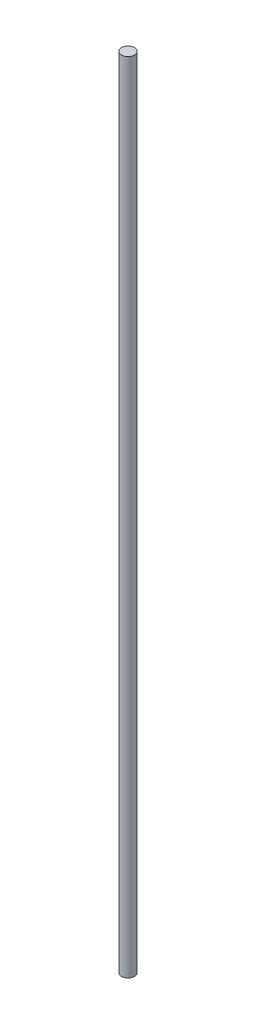
ISO-10303-21;
HEADER;
FILE_DESCRIPTION(('STEP AP214'),'2;1');
FILE_NAME('part.step','',(''),(''),'','','');
FILE_SCHEMA(('AUTOMOTIVE_DESIGN { 1 0 10303 214 1 1 1 1 }'));
ENDSEC;
DATA;
#1=APPLICATION_CONTEXT('core data for automotive mechanical design processes');
#2=APPLICATION_PROTOCOL_DEFINITION('international standard','automotive_design',2000,#1);
#3=PRODUCT_CONTEXT('',#1,'mechanical');
#4=PRODUCT('Part','Part','',(#3));
#5=PRODUCT_RELATED_PRODUCT_CATEGORY('part','',(#4));
#6=PRODUCT_DEFINITION_FORMATION('','',#4);
#7=PRODUCT_DEFINITION_CONTEXT('part definition',#1,'design');
#8=PRODUCT_DEFINITION('design','',#6,#7);
#9=PRODUCT_DEFINITION_SHAPE('','',#8);
#10=(LENGTH_UNIT() NAMED_UNIT(*) SI_UNIT(.MILLI.,.METRE.));
#11=(NAMED_UNIT(*) PLANE_ANGLE_UNIT() SI_UNIT($,.RADIAN.));
#12=(NAMED_UNIT(*) SI_UNIT($,.STERADIAN.) SOLID_ANGLE_UNIT());
#13=UNCERTAINTY_MEASURE_WITH_UNIT(LENGTH_MEASURE(1.E-05),#10,'distance_accuracy_value','');
#14=(GEOMETRIC_REPRESENTATION_CONTEXT(3) GLOBAL_UNCERTAINTY_ASSIGNED_CONTEXT((#13)) GLOBAL_UNIT_ASSIGNED_CONTEXT((#10,
#11,#12)) REPRESENTATION_CONTEXT('',''));
#15=CARTESIAN_POINT('',(0.,0.,0.));
#16=DIRECTION('',(0.,0.,1.));
#17=DIRECTION('',(1.,0.,0.));
#18=AXIS2_PLACEMENT_3D('',#15,#16,#17);
#19=CARTESIAN_POINT('',(0.,490.,0.));
#20=DIRECTION('',(0.,-1.,0.));
#21=DIRECTION('',(0.,0.,-1.));
#22=AXIS2_PLACEMENT_3D('',#19,#20,#21);
#23=CYLINDRICAL_SURFACE('',#22,4.);
#24=CARTESIAN_POINT('',(0.,490.,0.));
#25=DIRECTION('',(0.,1.,0.));
#26=DIRECTION('',(0.,0.,1.));
#27=AXIS2_PLACEMENT_3D('',#24,#25,#26);
#28=CIRCLE('',#27,4.);
#29=CARTESIAN_POINT('',(0.,490.,4.));
#30=VERTEX_POINT('',#29);
#31=EDGE_CURVE('E10',#30,#30,#28,.T.);
#32=ORIENTED_EDGE('',*,*,#31,.F.);
#33=EDGE_LOOP('',(#32));
#34=FACE_BOUND('',#33,.T.);
#35=CARTESIAN_POINT('',(0.,0.,0.));
#36=DIRECTION('',(0.,1.,0.));
#37=DIRECTION('',(0.,0.,1.));
#38=AXIS2_PLACEMENT_3D('',#35,#36,#37);
#39=CIRCLE('',#38,4.);
#40=CARTESIAN_POINT('',(0.,0.,4.));
#41=VERTEX_POINT('',#40);
#42=EDGE_CURVE('E40',#41,#41,#39,.T.);
#43=ORIENTED_EDGE('',*,*,#42,.T.);
#44=EDGE_LOOP('',(#43));
#45=FACE_BOUND('',#44,.T.);
#46=ADVANCED_FACE('F37',(#34,#45),#23,.T.);
#47=CARTESIAN_POINT('',(0.,490.,0.));
#48=DIRECTION('',(0.,1.,0.));
#49=DIRECTION('',(0.,0.,1.));
#50=AXIS2_PLACEMENT_3D('',#47,#48,#49);
#51=PLANE('',#50);
#52=ORIENTED_EDGE('',*,*,#31,.T.);
#53=EDGE_LOOP('',(#52));
#54=FACE_BOUND('',#53,.T.);
#55=ADVANCED_FACE('F54',(#54),#51,.T.);
#56=CARTESIAN_POINT('',(0.,0.,0.));
#57=DIRECTION('',(0.,1.,0.));
#58=DIRECTION('',(0.,0.,1.));
#59=AXIS2_PLACEMENT_3D('',#56,#57,#58);
#60=PLANE('',#59);
#61=ORIENTED_EDGE('',*,*,#42,.F.);
#62=EDGE_LOOP('',(#61));
#63=FACE_BOUND('',#62,.T.);
#64=ADVANCED_FACE('F52',(#63),#60,.F.);
#65=CLOSED_SHELL('',(#46,#55,#64));
#66=MANIFOLD_SOLID_BREP('B2',#65);
#67=ADVANCED_BREP_SHAPE_REPRESENTATION('',(#18,#66),#14);
#68=SHAPE_DEFINITION_REPRESENTATION(#9,#67);
ENDSEC;
END-ISO-10303-21;
